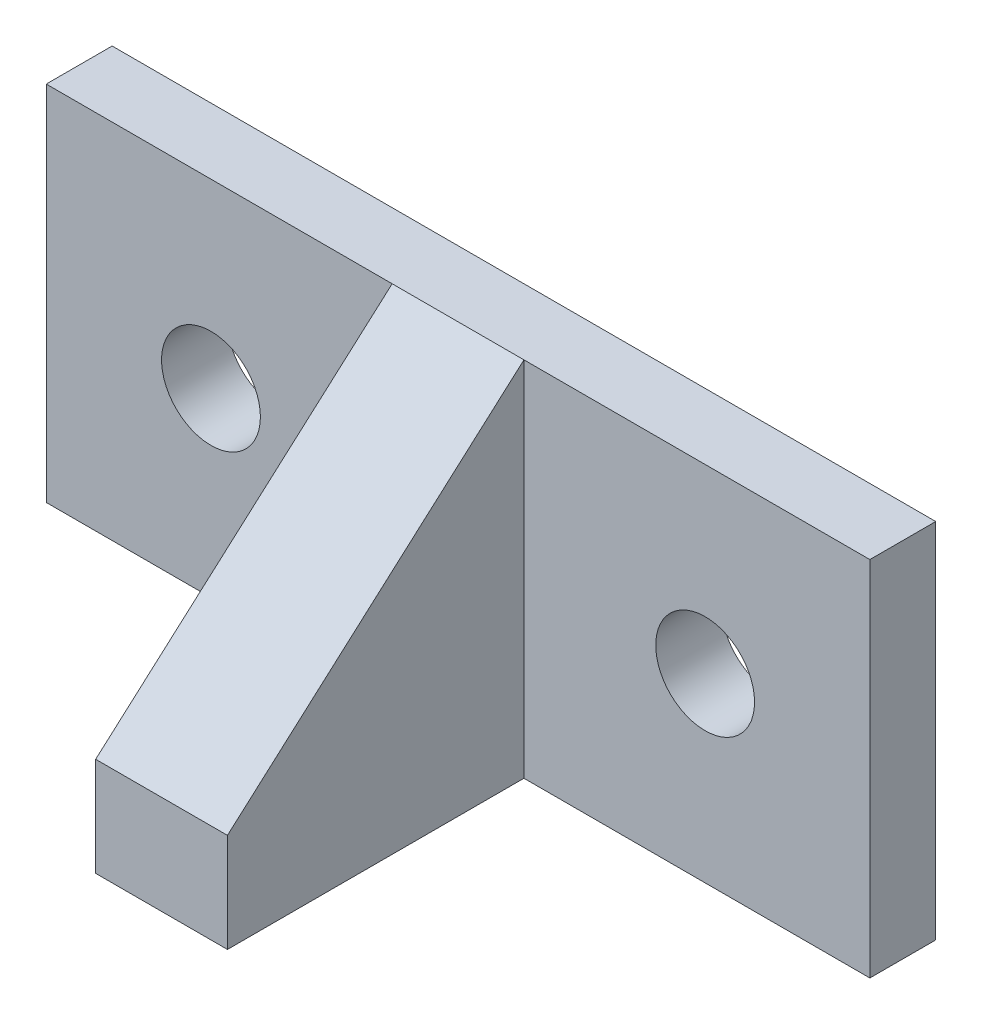
ISO-10303-21;
HEADER;
FILE_DESCRIPTION(('STEP AP214'),'2;1');
FILE_NAME('part.step','',(''),(''),'','','');
FILE_SCHEMA(('AUTOMOTIVE_DESIGN { 1 0 10303 214 1 1 1 1 }'));
ENDSEC;
DATA;
#1=APPLICATION_CONTEXT('core data for automotive mechanical design processes');
#2=APPLICATION_PROTOCOL_DEFINITION('international standard','automotive_design',2000,#1);
#3=PRODUCT_CONTEXT('',#1,'mechanical');
#4=PRODUCT('Part','Part','',(#3));
#5=PRODUCT_RELATED_PRODUCT_CATEGORY('part','',(#4));
#6=PRODUCT_DEFINITION_FORMATION('','',#4);
#7=PRODUCT_DEFINITION_CONTEXT('part definition',#1,'design');
#8=PRODUCT_DEFINITION('design','',#6,#7);
#9=PRODUCT_DEFINITION_SHAPE('','',#8);
#10=(LENGTH_UNIT() NAMED_UNIT(*) SI_UNIT(.MILLI.,.METRE.));
#11=(NAMED_UNIT(*) PLANE_ANGLE_UNIT() SI_UNIT($,.RADIAN.));
#12=(NAMED_UNIT(*) SI_UNIT($,.STERADIAN.) SOLID_ANGLE_UNIT());
#13=UNCERTAINTY_MEASURE_WITH_UNIT(LENGTH_MEASURE(1.E-05),#10,'distance_accuracy_value','');
#14=(GEOMETRIC_REPRESENTATION_CONTEXT(3) GLOBAL_UNCERTAINTY_ASSIGNED_CONTEXT((#13)) GLOBAL_UNIT_ASSIGNED_CONTEXT((#10,
#11,#12)) REPRESENTATION_CONTEXT('',''));
#15=CARTESIAN_POINT('',(0.,0.,0.));
#16=DIRECTION('',(0.,0.,1.));
#17=DIRECTION('',(1.,0.,0.));
#18=AXIS2_PLACEMENT_3D('',#15,#16,#17);
#19=CARTESIAN_POINT('',(0.,0.,10.));
#20=DIRECTION('',(0.,0.,1.));
#21=DIRECTION('',(1.,0.,0.));
#22=AXIS2_PLACEMENT_3D('',#19,#20,#21);
#23=PLANE('',#22);
#24=CARTESIAN_POINT('',(37.5,0.,10.));
#25=DIRECTION('',(0.,0.,1.));
#26=DIRECTION('',(1.,0.,0.));
#27=AXIS2_PLACEMENT_3D('',#24,#25,#26);
#28=CIRCLE('',#27,7.5);
#29=CARTESIAN_POINT('',(45.,0.,10.));
#30=VERTEX_POINT('',#29);
#31=EDGE_CURVE('E153',#30,#30,#28,.T.);
#32=ORIENTED_EDGE('',*,*,#31,.F.);
#33=EDGE_LOOP('',(#32));
#34=FACE_BOUND('',#33,.T.);
#35=DIRECTION('',(-1.,0.,0.));
#36=VECTOR('',#35,1.);
#37=CARTESIAN_POINT('',(62.5,27.5,10.));
#38=LINE('',#37,#36);
#39=CARTESIAN_POINT('',(62.5,27.5,10.));
#40=VERTEX_POINT('',#39);
#41=CARTESIAN_POINT('',(10.,27.5,10.));
#42=VERTEX_POINT('',#41);
#43=EDGE_CURVE('E185',#40,#42,#38,.T.);
#44=ORIENTED_EDGE('',*,*,#43,.T.);
#45=DIRECTION('',(0.,-1.,0.));
#46=VECTOR('',#45,1.);
#47=CARTESIAN_POINT('',(10.,0.,10.));
#48=LINE('',#47,#46);
#49=CARTESIAN_POINT('',(10.,-27.5,10.));
#50=VERTEX_POINT('',#49);
#51=EDGE_CURVE('E11',#42,#50,#48,.T.);
#52=ORIENTED_EDGE('',*,*,#51,.T.);
#53=DIRECTION('',(1.,0.,0.));
#54=VECTOR('',#53,1.);
#55=CARTESIAN_POINT('',(62.5,-27.5,10.));
#56=LINE('',#55,#54);
#57=CARTESIAN_POINT('',(62.5,-27.5,10.));
#58=VERTEX_POINT('',#57);
#59=EDGE_CURVE('E174',#50,#58,#56,.T.);
#60=ORIENTED_EDGE('',*,*,#59,.T.);
#61=DIRECTION('',(0.,1.,0.));
#62=VECTOR('',#61,1.);
#63=CARTESIAN_POINT('',(62.5,-27.5,10.));
#64=LINE('',#63,#62);
#65=EDGE_CURVE('E176',#58,#40,#64,.T.);
#66=ORIENTED_EDGE('',*,*,#65,.T.);
#67=EDGE_LOOP('',(#44,#52,#60,#66));
#68=FACE_BOUND('',#67,.T.);
#69=ADVANCED_FACE('F44',(#34,#68),#23,.T.);
#70=DIRECTION('',(0.,-1.,0.));
#71=VECTOR('',#70,1.);
#72=CARTESIAN_POINT('',(-10.,0.,10.));
#73=LINE('',#72,#71);
#74=CARTESIAN_POINT('',(-9.99999999999999,27.5,10.));
#75=VERTEX_POINT('',#74);
#76=CARTESIAN_POINT('',(-10.,-27.5,10.));
#77=VERTEX_POINT('',#76);
#78=EDGE_CURVE('E53',#75,#77,#73,.T.);
#79=ORIENTED_EDGE('',*,*,#78,.F.);
#80=CARTESIAN_POINT('',(-62.5,27.5,10.));
#81=VERTEX_POINT('',#80);
#82=EDGE_CURVE('E182',#75,#81,#38,.T.);
#83=ORIENTED_EDGE('',*,*,#82,.T.);
#84=DIRECTION('',(0.,-1.,0.));
#85=VECTOR('',#84,1.);
#86=CARTESIAN_POINT('',(-62.5,-27.5,10.));
#87=LINE('',#86,#85);
#88=CARTESIAN_POINT('',(-62.5,-27.5,10.));
#89=VERTEX_POINT('',#88);
#90=EDGE_CURVE('E166',#81,#89,#87,.T.);
#91=ORIENTED_EDGE('',*,*,#90,.T.);
#92=EDGE_CURVE('E173',#89,#77,#56,.T.);
#93=ORIENTED_EDGE('',*,*,#92,.T.);
#94=EDGE_LOOP('',(#79,#83,#91,#93));
#95=FACE_BOUND('',#94,.T.);
#96=CARTESIAN_POINT('',(-37.5,0.,10.));
#97=DIRECTION('',(0.,0.,1.));
#98=DIRECTION('',(1.,0.,0.));
#99=AXIS2_PLACEMENT_3D('',#96,#97,#98);
#100=CIRCLE('',#99,7.5);
#101=CARTESIAN_POINT('',(-30.,0.,10.));
#102=VERTEX_POINT('',#101);
#103=EDGE_CURVE('E161',#102,#102,#100,.T.);
#104=ORIENTED_EDGE('',*,*,#103,.F.);
#105=EDGE_LOOP('',(#104));
#106=FACE_BOUND('',#105,.T.);
#107=ADVANCED_FACE('F221',(#95,#106),#23,.T.);
#108=CARTESIAN_POINT('',(0.,0.,0.));
#109=DIRECTION('',(0.,0.,1.));
#110=DIRECTION('',(1.,0.,0.));
#111=AXIS2_PLACEMENT_3D('',#108,#109,#110);
#112=PLANE('',#111);
#113=DIRECTION('',(0.,1.,0.));
#114=VECTOR('',#113,1.);
#115=CARTESIAN_POINT('',(62.5,-27.5,0.));
#116=LINE('',#115,#114);
#117=CARTESIAN_POINT('',(62.5,-27.5,0.));
#118=VERTEX_POINT('',#117);
#119=CARTESIAN_POINT('',(62.5,27.5,0.));
#120=VERTEX_POINT('',#119);
#121=EDGE_CURVE('E195',#118,#120,#116,.T.);
#122=ORIENTED_EDGE('',*,*,#121,.F.);
#123=DIRECTION('',(1.,0.,0.));
#124=VECTOR('',#123,1.);
#125=CARTESIAN_POINT('',(62.5,-27.5,0.));
#126=LINE('',#125,#124);
#127=CARTESIAN_POINT('',(-62.5,-27.5,0.));
#128=VERTEX_POINT('',#127);
#129=EDGE_CURVE('E186',#128,#118,#126,.T.);
#130=ORIENTED_EDGE('',*,*,#129,.F.);
#131=DIRECTION('',(0.,-1.,0.));
#132=VECTOR('',#131,1.);
#133=CARTESIAN_POINT('',(-62.5,-27.5,0.));
#134=LINE('',#133,#132);
#135=CARTESIAN_POINT('',(-62.5,27.5,0.));
#136=VERTEX_POINT('',#135);
#137=EDGE_CURVE('E164',#136,#128,#134,.T.);
#138=ORIENTED_EDGE('',*,*,#137,.F.);
#139=DIRECTION('',(-1.,0.,0.));
#140=VECTOR('',#139,1.);
#141=CARTESIAN_POINT('',(62.5,27.5,0.));
#142=LINE('',#141,#140);
#143=EDGE_CURVE('E171',#120,#136,#142,.T.);
#144=ORIENTED_EDGE('',*,*,#143,.F.);
#145=EDGE_LOOP('',(#122,#130,#138,#144));
#146=FACE_BOUND('',#145,.T.);
#147=CARTESIAN_POINT('',(37.5,0.,0.));
#148=DIRECTION('',(0.,0.,1.));
#149=DIRECTION('',(1.,0.,0.));
#150=AXIS2_PLACEMENT_3D('',#147,#148,#149);
#151=CIRCLE('',#150,7.5);
#152=CARTESIAN_POINT('',(45.,0.,0.));
#153=VERTEX_POINT('',#152);
#154=EDGE_CURVE('E155',#153,#153,#151,.T.);
#155=ORIENTED_EDGE('',*,*,#154,.T.);
#156=EDGE_LOOP('',(#155));
#157=FACE_BOUND('',#156,.T.);
#158=CARTESIAN_POINT('',(-37.5,0.,0.));
#159=DIRECTION('',(0.,0.,1.));
#160=DIRECTION('',(1.,0.,0.));
#161=AXIS2_PLACEMENT_3D('',#158,#159,#160);
#162=CIRCLE('',#161,7.5);
#163=CARTESIAN_POINT('',(-30.,0.,0.));
#164=VERTEX_POINT('',#163);
#165=EDGE_CURVE('E160',#164,#164,#162,.T.);
#166=ORIENTED_EDGE('',*,*,#165,.T.);
#167=EDGE_LOOP('',(#166));
#168=FACE_BOUND('',#167,.T.);
#169=ADVANCED_FACE('F240',(#146,#157,#168),#112,.F.);
#170=CARTESIAN_POINT('',(-62.5,-27.5,10.));
#171=DIRECTION('',(1.,0.,0.));
#172=DIRECTION('',(0.,0.,-1.));
#173=AXIS2_PLACEMENT_3D('',#170,#171,#172);
#174=PLANE('',#173);
#175=ORIENTED_EDGE('',*,*,#137,.T.);
#176=DIRECTION('',(0.,0.,-1.));
#177=VECTOR('',#176,1.);
#178=CARTESIAN_POINT('',(-62.5,-27.5,10.));
#179=LINE('',#178,#177);
#180=EDGE_CURVE('E208',#89,#128,#179,.T.);
#181=ORIENTED_EDGE('',*,*,#180,.F.);
#182=ORIENTED_EDGE('',*,*,#90,.F.);
#183=DIRECTION('',(0.,0.,-1.));
#184=VECTOR('',#183,1.);
#185=CARTESIAN_POINT('',(-62.5,27.5,10.));
#186=LINE('',#185,#184);
#187=EDGE_CURVE('E183',#81,#136,#186,.T.);
#188=ORIENTED_EDGE('',*,*,#187,.T.);
#189=EDGE_LOOP('',(#175,#181,#182,#188));
#190=FACE_BOUND('',#189,.T.);
#191=ADVANCED_FACE('F50',(#190),#174,.F.);
#192=CARTESIAN_POINT('',(62.5,-27.5,10.));
#193=DIRECTION('',(0.,1.,0.));
#194=DIRECTION('',(-1.,0.,0.));
#195=AXIS2_PLACEMENT_3D('',#192,#193,#194);
#196=PLANE('',#195);
#197=ORIENTED_EDGE('',*,*,#59,.F.);
#198=DIRECTION('',(0.,0.,-1.));
#199=VECTOR('',#198,1.);
#200=CARTESIAN_POINT('',(10.,-27.5,0.));
#201=LINE('',#200,#199);
#202=CARTESIAN_POINT('',(10.,-27.5,55.));
#203=VERTEX_POINT('',#202);
#204=EDGE_CURVE('E133',#203,#50,#201,.T.);
#205=ORIENTED_EDGE('',*,*,#204,.F.);
#206=DIRECTION('',(-1.,0.,0.));
#207=VECTOR('',#206,1.);
#208=CARTESIAN_POINT('',(10.,-27.5,55.));
#209=LINE('',#208,#207);
#210=CARTESIAN_POINT('',(-10.,-27.5,55.));
#211=VERTEX_POINT('',#210);
#212=EDGE_CURVE('E129',#203,#211,#209,.T.);
#213=ORIENTED_EDGE('',*,*,#212,.T.);
#214=DIRECTION('',(0.,0.,-1.));
#215=VECTOR('',#214,1.);
#216=CARTESIAN_POINT('',(-10.,-27.5,0.));
#217=LINE('',#216,#215);
#218=EDGE_CURVE('E116',#211,#77,#217,.T.);
#219=ORIENTED_EDGE('',*,*,#218,.T.);
#220=ORIENTED_EDGE('',*,*,#92,.F.);
#221=ORIENTED_EDGE('',*,*,#180,.T.);
#222=ORIENTED_EDGE('',*,*,#129,.T.);
#223=DIRECTION('',(0.,0.,-1.));
#224=VECTOR('',#223,1.);
#225=CARTESIAN_POINT('',(62.5,-27.5,10.));
#226=LINE('',#225,#224);
#227=EDGE_CURVE('E204',#58,#118,#226,.T.);
#228=ORIENTED_EDGE('',*,*,#227,.F.);
#229=EDGE_LOOP('',(#197,#205,#213,#219,#220,#221,#222,#228));
#230=FACE_BOUND('',#229,.T.);
#231=ADVANCED_FACE('F220',(#230),#196,.F.);
#232=CARTESIAN_POINT('',(62.5,-27.5,10.));
#233=DIRECTION('',(-1.,0.,0.));
#234=DIRECTION('',(0.,0.,1.));
#235=AXIS2_PLACEMENT_3D('',#232,#233,#234);
#236=PLANE('',#235);
#237=ORIENTED_EDGE('',*,*,#121,.T.);
#238=DIRECTION('',(0.,0.,-1.));
#239=VECTOR('',#238,1.);
#240=CARTESIAN_POINT('',(62.5,27.5,10.));
#241=LINE('',#240,#239);
#242=EDGE_CURVE('E199',#40,#120,#241,.T.);
#243=ORIENTED_EDGE('',*,*,#242,.F.);
#244=ORIENTED_EDGE('',*,*,#65,.F.);
#245=ORIENTED_EDGE('',*,*,#227,.T.);
#246=EDGE_LOOP('',(#237,#243,#244,#245));
#247=FACE_BOUND('',#246,.T.);
#248=ADVANCED_FACE('F234',(#247),#236,.F.);
#249=CARTESIAN_POINT('',(62.5,27.5,10.));
#250=DIRECTION('',(0.,-1.,0.));
#251=DIRECTION('',(1.,0.,0.));
#252=AXIS2_PLACEMENT_3D('',#249,#250,#251);
#253=PLANE('',#252);
#254=ORIENTED_EDGE('',*,*,#143,.T.);
#255=ORIENTED_EDGE('',*,*,#187,.F.);
#256=ORIENTED_EDGE('',*,*,#82,.F.);
#257=DIRECTION('',(-1.,0.,0.));
#258=VECTOR('',#257,1.);
#259=CARTESIAN_POINT('',(10.,27.5,10.));
#260=LINE('',#259,#258);
#261=EDGE_CURVE('E70',#42,#75,#260,.T.);
#262=ORIENTED_EDGE('',*,*,#261,.F.);
#263=ORIENTED_EDGE('',*,*,#43,.F.);
#264=ORIENTED_EDGE('',*,*,#242,.T.);
#265=EDGE_LOOP('',(#254,#255,#256,#262,#263,#264));
#266=FACE_BOUND('',#265,.T.);
#267=ADVANCED_FACE('F229',(#266),#253,.F.);
#268=CARTESIAN_POINT('',(-37.5,0.,10.));
#269=DIRECTION('',(0.,0.,-1.));
#270=DIRECTION('',(-1.,0.,0.));
#271=AXIS2_PLACEMENT_3D('',#268,#269,#270);
#272=CYLINDRICAL_SURFACE('',#271,7.5);
#273=ORIENTED_EDGE('',*,*,#103,.T.);
#274=EDGE_LOOP('',(#273));
#275=FACE_BOUND('',#274,.T.);
#276=ORIENTED_EDGE('',*,*,#165,.F.);
#277=EDGE_LOOP('',(#276));
#278=FACE_BOUND('',#277,.T.);
#279=ADVANCED_FACE('F243',(#275,#278),#272,.F.);
#280=CARTESIAN_POINT('',(37.5,0.,10.));
#281=DIRECTION('',(0.,0.,-1.));
#282=DIRECTION('',(-1.,0.,0.));
#283=AXIS2_PLACEMENT_3D('',#280,#281,#282);
#284=CYLINDRICAL_SURFACE('',#283,7.5);
#285=ORIENTED_EDGE('',*,*,#31,.T.);
#286=EDGE_LOOP('',(#285));
#287=FACE_BOUND('',#286,.T.);
#288=ORIENTED_EDGE('',*,*,#154,.F.);
#289=EDGE_LOOP('',(#288));
#290=FACE_BOUND('',#289,.T.);
#291=ADVANCED_FACE('F250',(#287,#290),#284,.F.);
#292=CARTESIAN_POINT('',(10.,-12.5,55.));
#293=DIRECTION('',(0.,-0.74740931868366,-0.66436383882992));
#294=DIRECTION('',(0.,0.66436383882992,-0.74740931868366));
#295=AXIS2_PLACEMENT_3D('',#292,#293,#294);
#296=PLANE('',#295);
#297=DIRECTION('',(0.,-0.66436383882992,0.74740931868366));
#298=VECTOR('',#297,1.);
#299=CARTESIAN_POINT('',(-10.,-12.5,55.));
#300=LINE('',#299,#298);
#301=CARTESIAN_POINT('',(-10.,-12.5,55.));
#302=VERTEX_POINT('',#301);
#303=EDGE_CURVE('E124',#75,#302,#300,.T.);
#304=ORIENTED_EDGE('',*,*,#303,.T.);
#305=DIRECTION('',(-1.,0.,0.));
#306=VECTOR('',#305,1.);
#307=CARTESIAN_POINT('',(10.,-12.5,55.));
#308=LINE('',#307,#306);
#309=CARTESIAN_POINT('',(10.,-12.5,55.));
#310=VERTEX_POINT('',#309);
#311=EDGE_CURVE('E125',#310,#302,#308,.T.);
#312=ORIENTED_EDGE('',*,*,#311,.F.);
#313=DIRECTION('',(0.,-0.66436383882992,0.74740931868366));
#314=VECTOR('',#313,1.);
#315=CARTESIAN_POINT('',(10.,-12.5,55.));
#316=LINE('',#315,#314);
#317=EDGE_CURVE('E109',#42,#310,#316,.T.);
#318=ORIENTED_EDGE('',*,*,#317,.F.);
#319=ORIENTED_EDGE('',*,*,#261,.T.);
#320=EDGE_LOOP('',(#304,#312,#318,#319));
#321=FACE_BOUND('',#320,.T.);
#322=ADVANCED_FACE('F121',(#321),#296,.F.);
#323=CARTESIAN_POINT('',(10.,-27.5,55.));
#324=DIRECTION('',(0.,0.,-1.));
#325=DIRECTION('',(-1.,0.,0.));
#326=AXIS2_PLACEMENT_3D('',#323,#324,#325);
#327=PLANE('',#326);
#328=DIRECTION('',(0.,-1.,0.));
#329=VECTOR('',#328,1.);
#330=CARTESIAN_POINT('',(-10.,-27.5,55.));
#331=LINE('',#330,#329);
#332=EDGE_CURVE('E142',#302,#211,#331,.T.);
#333=ORIENTED_EDGE('',*,*,#332,.T.);
#334=ORIENTED_EDGE('',*,*,#212,.F.);
#335=DIRECTION('',(0.,-1.,0.));
#336=VECTOR('',#335,1.);
#337=CARTESIAN_POINT('',(10.,-27.5,55.));
#338=LINE('',#337,#336);
#339=EDGE_CURVE('E113',#310,#203,#338,.T.);
#340=ORIENTED_EDGE('',*,*,#339,.F.);
#341=ORIENTED_EDGE('',*,*,#311,.T.);
#342=EDGE_LOOP('',(#333,#334,#340,#341));
#343=FACE_BOUND('',#342,.T.);
#344=ADVANCED_FACE('F132',(#343),#327,.F.);
#345=CARTESIAN_POINT('',(10.,0.,0.));
#346=DIRECTION('',(-1.,0.,0.));
#347=DIRECTION('',(0.,0.,1.));
#348=AXIS2_PLACEMENT_3D('',#345,#346,#347);
#349=PLANE('',#348);
#350=ORIENTED_EDGE('',*,*,#51,.F.);
#351=ORIENTED_EDGE('',*,*,#317,.T.);
#352=ORIENTED_EDGE('',*,*,#339,.T.);
#353=ORIENTED_EDGE('',*,*,#204,.T.);
#354=EDGE_LOOP('',(#350,#351,#352,#353));
#355=FACE_BOUND('',#354,.T.);
#356=ADVANCED_FACE('F115',(#355),#349,.F.);
#357=CARTESIAN_POINT('',(-10.,0.,0.));
#358=DIRECTION('',(-1.,0.,0.));
#359=DIRECTION('',(0.,0.,1.));
#360=AXIS2_PLACEMENT_3D('',#357,#358,#359);
#361=PLANE('',#360);
#362=ORIENTED_EDGE('',*,*,#303,.F.);
#363=ORIENTED_EDGE('',*,*,#78,.T.);
#364=ORIENTED_EDGE('',*,*,#218,.F.);
#365=ORIENTED_EDGE('',*,*,#332,.F.);
#366=EDGE_LOOP('',(#362,#363,#364,#365));
#367=FACE_BOUND('',#366,.T.);
#368=ADVANCED_FACE('F212',(#367),#361,.T.);
#369=CLOSED_SHELL('',(#69,#107,#169,#191,#231,#248,#267,#279,#291,#322,#344,#356,#368));
#370=MANIFOLD_SOLID_BREP('B2',#369);
#371=ADVANCED_BREP_SHAPE_REPRESENTATION('',(#18,#370),#14);
#372=SHAPE_DEFINITION_REPRESENTATION(#9,#371);
ENDSEC;
END-ISO-10303-21;
